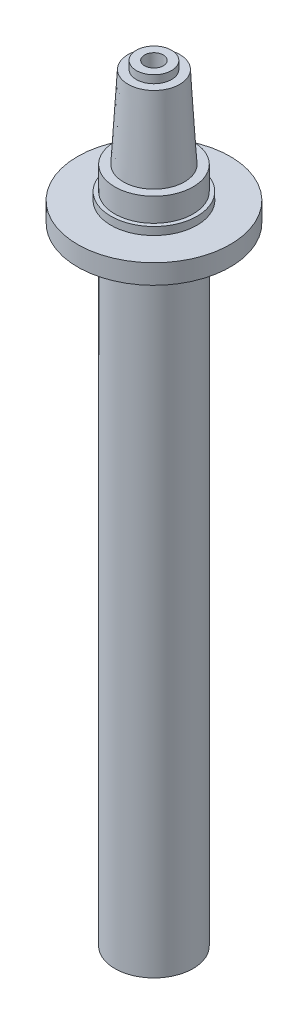
ISO-10303-21;
HEADER;
FILE_DESCRIPTION(('STEP AP214'),'2;1');
FILE_NAME('part.step','',(''),(''),'','','');
FILE_SCHEMA(('AUTOMOTIVE_DESIGN { 1 0 10303 214 1 1 1 1 }'));
ENDSEC;
DATA;
#1=APPLICATION_CONTEXT('core data for automotive mechanical design processes');
#2=APPLICATION_PROTOCOL_DEFINITION('international standard','automotive_design',2000,#1);
#3=PRODUCT_CONTEXT('',#1,'mechanical');
#4=PRODUCT('Part','Part','',(#3));
#5=PRODUCT_RELATED_PRODUCT_CATEGORY('part','',(#4));
#6=PRODUCT_DEFINITION_FORMATION('','',#4);
#7=PRODUCT_DEFINITION_CONTEXT('part definition',#1,'design');
#8=PRODUCT_DEFINITION('design','',#6,#7);
#9=PRODUCT_DEFINITION_SHAPE('','',#8);
#10=(LENGTH_UNIT() NAMED_UNIT(*) SI_UNIT(.MILLI.,.METRE.));
#11=(NAMED_UNIT(*) PLANE_ANGLE_UNIT() SI_UNIT($,.RADIAN.));
#12=(NAMED_UNIT(*) SI_UNIT($,.STERADIAN.) SOLID_ANGLE_UNIT());
#13=UNCERTAINTY_MEASURE_WITH_UNIT(LENGTH_MEASURE(1.E-05),#10,'distance_accuracy_value','');
#14=(GEOMETRIC_REPRESENTATION_CONTEXT(3) GLOBAL_UNCERTAINTY_ASSIGNED_CONTEXT((#13)) GLOBAL_UNIT_ASSIGNED_CONTEXT((#10,
#11,#12)) REPRESENTATION_CONTEXT('',''));
#15=CARTESIAN_POINT('',(0.,0.,0.));
#16=DIRECTION('',(0.,0.,1.));
#17=DIRECTION('',(1.,0.,0.));
#18=AXIS2_PLACEMENT_3D('',#15,#16,#17);
#19=CARTESIAN_POINT('',(0.,92.,0.));
#20=DIRECTION('',(0.,1.,0.));
#21=DIRECTION('',(-1.,0.,0.));
#22=AXIS2_PLACEMENT_3D('',#19,#20,#21);
#23=CYLINDRICAL_SURFACE('',#22,5.);
#24=CARTESIAN_POINT('',(0.,83.5,0.));
#25=DIRECTION('',(0.,1.,0.));
#26=DIRECTION('',(-1.,0.,0.));
#27=AXIS2_PLACEMENT_3D('',#24,#25,#26);
#28=CIRCLE('',#27,5.);
#29=CARTESIAN_POINT('',(-5.,83.5,0.));
#30=VERTEX_POINT('',#29);
#31=EDGE_CURVE('E59',#30,#30,#28,.T.);
#32=ORIENTED_EDGE('',*,*,#31,.T.);
#33=EDGE_LOOP('',(#32));
#34=FACE_BOUND('',#33,.T.);
#35=CARTESIAN_POINT('',(0.,86.5,0.));
#36=DIRECTION('',(0.,1.,0.));
#37=DIRECTION('',(-1.,0.,0.));
#38=AXIS2_PLACEMENT_3D('',#35,#36,#37);
#39=CIRCLE('',#38,5.);
#40=CARTESIAN_POINT('',(-5.,86.5,0.));
#41=VERTEX_POINT('',#40);
#42=EDGE_CURVE('E95',#41,#41,#39,.T.);
#43=ORIENTED_EDGE('',*,*,#42,.F.);
#44=EDGE_LOOP('',(#43));
#45=FACE_BOUND('',#44,.T.);
#46=ADVANCED_FACE('F37',(#34,#45),#23,.T.);
#47=CARTESIAN_POINT('',(5.,86.5,0.));
#48=DIRECTION('',(0.,-1.,0.));
#49=DIRECTION('',(1.,0.,0.));
#50=AXIS2_PLACEMENT_3D('',#47,#48,#49);
#51=PLANE('',#50);
#52=CARTESIAN_POINT('',(0.,86.5,0.));
#53=DIRECTION('',(0.,1.,0.));
#54=DIRECTION('',(-1.,0.,0.));
#55=AXIS2_PLACEMENT_3D('',#52,#53,#54);
#56=CIRCLE('',#55,3.9);
#57=CARTESIAN_POINT('',(-3.9,86.5,0.));
#58=VERTEX_POINT('',#57);
#59=EDGE_CURVE('E91',#58,#58,#56,.T.);
#60=ORIENTED_EDGE('',*,*,#59,.F.);
#61=EDGE_LOOP('',(#60));
#62=FACE_BOUND('',#61,.T.);
#63=ORIENTED_EDGE('',*,*,#42,.T.);
#64=EDGE_LOOP('',(#63));
#65=FACE_BOUND('',#64,.T.);
#66=ADVANCED_FACE('F122',(#62,#65),#51,.F.);
#67=CARTESIAN_POINT('',(0.,86.5,0.));
#68=DIRECTION('',(0.,-1.,0.));
#69=DIRECTION('',(1.,0.,0.));
#70=AXIS2_PLACEMENT_3D('',#67,#68,#69);
#71=CONICAL_SURFACE('',#70,3.9,0.0570807824062647);
#72=CARTESIAN_POINT('',(0.,97.,0.));
#73=DIRECTION('',(0.,1.,0.));
#74=DIRECTION('',(-1.,0.,0.));
#75=AXIS2_PLACEMENT_3D('',#72,#73,#74);
#76=CIRCLE('',#75,3.3);
#77=CARTESIAN_POINT('',(-3.3,97.,0.));
#78=VERTEX_POINT('',#77);
#79=EDGE_CURVE('E87',#78,#78,#76,.T.);
#80=ORIENTED_EDGE('',*,*,#79,.F.);
#81=EDGE_LOOP('',(#80));
#82=FACE_BOUND('',#81,.T.);
#83=ORIENTED_EDGE('',*,*,#59,.T.);
#84=EDGE_LOOP('',(#83));
#85=FACE_BOUND('',#84,.T.);
#86=ADVANCED_FACE('F129',(#82,#85),#71,.T.);
#87=CARTESIAN_POINT('',(3.3,97.,0.));
#88=DIRECTION('',(0.,-1.,0.));
#89=DIRECTION('',(1.,0.,0.));
#90=AXIS2_PLACEMENT_3D('',#87,#88,#89);
#91=PLANE('',#90);
#92=CARTESIAN_POINT('',(0.,97.,0.));
#93=DIRECTION('',(0.,1.,0.));
#94=DIRECTION('',(-1.,0.,0.));
#95=AXIS2_PLACEMENT_3D('',#92,#93,#94);
#96=CIRCLE('',#95,2.25);
#97=CARTESIAN_POINT('',(-2.25,97.,0.));
#98=VERTEX_POINT('',#97);
#99=EDGE_CURVE('E83',#98,#98,#96,.T.);
#100=ORIENTED_EDGE('',*,*,#99,.F.);
#101=EDGE_LOOP('',(#100));
#102=FACE_BOUND('',#101,.T.);
#103=ORIENTED_EDGE('',*,*,#79,.T.);
#104=EDGE_LOOP('',(#103));
#105=FACE_BOUND('',#104,.T.);
#106=ADVANCED_FACE('F168',(#102,#105),#91,.F.);
#107=CARTESIAN_POINT('',(0.,92.,0.));
#108=DIRECTION('',(0.,1.,0.));
#109=DIRECTION('',(-1.,0.,0.));
#110=AXIS2_PLACEMENT_3D('',#107,#108,#109);
#111=CYLINDRICAL_SURFACE('',#110,2.25);
#112=CARTESIAN_POINT('',(0.,98.,0.));
#113=DIRECTION('',(0.,1.,0.));
#114=DIRECTION('',(-1.,0.,0.));
#115=AXIS2_PLACEMENT_3D('',#112,#113,#114);
#116=CIRCLE('',#115,2.25);
#117=CARTESIAN_POINT('',(-2.25,98.,0.));
#118=VERTEX_POINT('',#117);
#119=EDGE_CURVE('E79',#118,#118,#116,.T.);
#120=ORIENTED_EDGE('',*,*,#119,.F.);
#121=EDGE_LOOP('',(#120));
#122=FACE_BOUND('',#121,.T.);
#123=ORIENTED_EDGE('',*,*,#99,.T.);
#124=EDGE_LOOP('',(#123));
#125=FACE_BOUND('',#124,.T.);
#126=ADVANCED_FACE('F175',(#122,#125),#111,.T.);
#127=CARTESIAN_POINT('',(2.25,98.,0.));
#128=DIRECTION('',(0.,-1.,0.));
#129=DIRECTION('',(1.,0.,0.));
#130=AXIS2_PLACEMENT_3D('',#127,#128,#129);
#131=PLANE('',#130);
#132=CARTESIAN_POINT('',(0.,98.,0.));
#133=DIRECTION('',(0.,1.,0.));
#134=DIRECTION('',(-1.,0.,0.));
#135=AXIS2_PLACEMENT_3D('',#132,#133,#134);
#136=CIRCLE('',#135,1.2);
#137=CARTESIAN_POINT('',(-1.2,98.,0.));
#138=VERTEX_POINT('',#137);
#139=EDGE_CURVE('E69',#138,#138,#136,.T.);
#140=ORIENTED_EDGE('',*,*,#139,.F.);
#141=EDGE_LOOP('',(#140));
#142=FACE_BOUND('',#141,.T.);
#143=ORIENTED_EDGE('',*,*,#119,.T.);
#144=EDGE_LOOP('',(#143));
#145=FACE_BOUND('',#144,.T.);
#146=ADVANCED_FACE('F183',(#142,#145),#131,.F.);
#147=CARTESIAN_POINT('',(0.,92.,0.));
#148=DIRECTION('',(0.,1.,0.));
#149=DIRECTION('',(-1.,0.,0.));
#150=AXIS2_PLACEMENT_3D('',#147,#148,#149);
#151=CYLINDRICAL_SURFACE('',#150,1.2);
#152=CARTESIAN_POINT('',(0.,92.,0.));
#153=DIRECTION('',(0.,1.,0.));
#154=DIRECTION('',(-1.,0.,0.));
#155=AXIS2_PLACEMENT_3D('',#152,#153,#154);
#156=CIRCLE('',#155,1.2);
#157=CARTESIAN_POINT('',(-1.2,92.,0.));
#158=VERTEX_POINT('',#157);
#159=EDGE_CURVE('E62',#158,#158,#156,.T.);
#160=ORIENTED_EDGE('',*,*,#159,.F.);
#161=EDGE_LOOP('',(#160));
#162=FACE_BOUND('',#161,.T.);
#163=ORIENTED_EDGE('',*,*,#139,.T.);
#164=EDGE_LOOP('',(#163));
#165=FACE_BOUND('',#164,.T.);
#166=ADVANCED_FACE('F191',(#162,#165),#151,.F.);
#167=CARTESIAN_POINT('',(1.2,92.,0.));
#168=DIRECTION('',(0.,-1.,0.));
#169=DIRECTION('',(1.,0.,0.));
#170=AXIS2_PLACEMENT_3D('',#167,#168,#169);
#171=PLANE('',#170);
#172=ORIENTED_EDGE('',*,*,#159,.T.);
#173=EDGE_LOOP('',(#172));
#174=FACE_BOUND('',#173,.T.);
#175=ADVANCED_FACE('F199',(#174),#171,.F.);
#176=CARTESIAN_POINT('',(0.,83.5,0.));
#177=DIRECTION('',(0.,-1.,0.));
#178=DIRECTION('',(1.,0.,0.));
#179=AXIS2_PLACEMENT_3D('',#176,#177,#178);
#180=CYLINDRICAL_SURFACE('',#179,5.5);
#181=CARTESIAN_POINT('',(0.,83.5,0.));
#182=DIRECTION('',(0.,1.,0.));
#183=DIRECTION('',(-1.,0.,0.));
#184=AXIS2_PLACEMENT_3D('',#181,#182,#183);
#185=CIRCLE('',#184,5.5);
#186=CARTESIAN_POINT('',(-5.5,83.5,0.));
#187=VERTEX_POINT('',#186);
#188=EDGE_CURVE('E63',#187,#187,#185,.T.);
#189=ORIENTED_EDGE('',*,*,#188,.F.);
#190=EDGE_LOOP('',(#189));
#191=FACE_BOUND('',#190,.T.);
#192=CARTESIAN_POINT('',(0.,82.5,0.));
#193=DIRECTION('',(0.,-1.,0.));
#194=DIRECTION('',(1.,0.,0.));
#195=AXIS2_PLACEMENT_3D('',#192,#193,#194);
#196=CIRCLE('',#195,5.5);
#197=CARTESIAN_POINT('',(5.5,82.5,0.));
#198=VERTEX_POINT('',#197);
#199=EDGE_CURVE('E10',#198,#198,#196,.F.);
#200=ORIENTED_EDGE('',*,*,#199,.T.);
#201=EDGE_LOOP('',(#200));
#202=FACE_BOUND('',#201,.T.);
#203=ADVANCED_FACE('F206',(#191,#202),#180,.T.);
#204=CARTESIAN_POINT('',(0.,83.5,0.));
#205=DIRECTION('',(0.,1.,0.));
#206=DIRECTION('',(-1.,0.,0.));
#207=AXIS2_PLACEMENT_3D('',#204,#205,#206);
#208=PLANE('',#207);
#209=ORIENTED_EDGE('',*,*,#31,.F.);
#210=EDGE_LOOP('',(#209));
#211=FACE_BOUND('',#210,.T.);
#212=ORIENTED_EDGE('',*,*,#188,.T.);
#213=EDGE_LOOP('',(#212));
#214=FACE_BOUND('',#213,.T.);
#215=ADVANCED_FACE('F119',(#211,#214),#208,.T.);
#216=CARTESIAN_POINT('',(0.,0.,0.));
#217=DIRECTION('',(0.,1.,0.));
#218=DIRECTION('',(-1.,0.,0.));
#219=AXIS2_PLACEMENT_3D('',#216,#217,#218);
#220=PLANE('',#219);
#221=CARTESIAN_POINT('',(0.,0.,0.));
#222=DIRECTION('',(0.,1.,0.));
#223=DIRECTION('',(-1.,0.,0.));
#224=AXIS2_PLACEMENT_3D('',#221,#222,#223);
#225=CIRCLE('',#224,5.);
#226=CARTESIAN_POINT('',(-5.,0.,0.));
#227=VERTEX_POINT('',#226);
#228=EDGE_CURVE('E45',#227,#227,#225,.T.);
#229=ORIENTED_EDGE('',*,*,#228,.F.);
#230=EDGE_LOOP('',(#229));
#231=FACE_BOUND('',#230,.T.);
#232=ADVANCED_FACE('F39',(#231),#220,.F.);
#233=CARTESIAN_POINT('',(0.,92.,0.));
#234=DIRECTION('',(0.,1.,0.));
#235=DIRECTION('',(-1.,0.,0.));
#236=AXIS2_PLACEMENT_3D('',#233,#234,#235);
#237=CYLINDRICAL_SURFACE('',#236,5.);
#238=CARTESIAN_POINT('',(0.,80.,0.));
#239=DIRECTION('',(0.,1.,0.));
#240=DIRECTION('',(-1.,0.,0.));
#241=AXIS2_PLACEMENT_3D('',#238,#239,#240);
#242=CIRCLE('',#241,5.);
#243=CARTESIAN_POINT('',(-5.,80.,0.));
#244=VERTEX_POINT('',#243);
#245=EDGE_CURVE('E50',#244,#244,#242,.T.);
#246=ORIENTED_EDGE('',*,*,#245,.F.);
#247=EDGE_LOOP('',(#246));
#248=FACE_BOUND('',#247,.T.);
#249=ORIENTED_EDGE('',*,*,#228,.T.);
#250=EDGE_LOOP('',(#249));
#251=FACE_BOUND('',#250,.T.);
#252=ADVANCED_FACE('F111',(#248,#251),#237,.T.);
#253=CARTESIAN_POINT('',(5.,80.,0.));
#254=DIRECTION('',(0.,1.,0.));
#255=DIRECTION('',(-1.,0.,0.));
#256=AXIS2_PLACEMENT_3D('',#253,#254,#255);
#257=PLANE('',#256);
#258=CARTESIAN_POINT('',(0.,80.,0.));
#259=DIRECTION('',(0.,1.,0.));
#260=DIRECTION('',(-1.,0.,0.));
#261=AXIS2_PLACEMENT_3D('',#258,#259,#260);
#262=CIRCLE('',#261,9.75);
#263=CARTESIAN_POINT('',(-9.75,80.,0.));
#264=VERTEX_POINT('',#263);
#265=EDGE_CURVE('E56',#264,#264,#262,.T.);
#266=ORIENTED_EDGE('',*,*,#265,.F.);
#267=EDGE_LOOP('',(#266));
#268=FACE_BOUND('',#267,.T.);
#269=ORIENTED_EDGE('',*,*,#245,.T.);
#270=EDGE_LOOP('',(#269));
#271=FACE_BOUND('',#270,.T.);
#272=ADVANCED_FACE('F108',(#268,#271),#257,.F.);
#273=CARTESIAN_POINT('',(0.,92.,0.));
#274=DIRECTION('',(0.,1.,0.));
#275=DIRECTION('',(-1.,0.,0.));
#276=AXIS2_PLACEMENT_3D('',#273,#274,#275);
#277=CYLINDRICAL_SURFACE('',#276,9.75);
#278=CARTESIAN_POINT('',(0.,82.5,0.));
#279=DIRECTION('',(0.,1.,0.));
#280=DIRECTION('',(-1.,0.,0.));
#281=AXIS2_PLACEMENT_3D('',#278,#279,#280);
#282=CIRCLE('',#281,9.75);
#283=CARTESIAN_POINT('',(-9.75,82.5,0.));
#284=VERTEX_POINT('',#283);
#285=EDGE_CURVE('E99',#284,#284,#282,.T.);
#286=ORIENTED_EDGE('',*,*,#285,.F.);
#287=EDGE_LOOP('',(#286));
#288=FACE_BOUND('',#287,.T.);
#289=ORIENTED_EDGE('',*,*,#265,.T.);
#290=EDGE_LOOP('',(#289));
#291=FACE_BOUND('',#290,.T.);
#292=ADVANCED_FACE('F106',(#288,#291),#277,.T.);
#293=CARTESIAN_POINT('',(9.75,82.5,0.));
#294=DIRECTION('',(0.,-1.,0.));
#295=DIRECTION('',(1.,0.,0.));
#296=AXIS2_PLACEMENT_3D('',#293,#294,#295);
#297=PLANE('',#296);
#298=ORIENTED_EDGE('',*,*,#199,.F.);
#299=EDGE_LOOP('',(#298));
#300=FACE_BOUND('',#299,.T.);
#301=ORIENTED_EDGE('',*,*,#285,.T.);
#302=EDGE_LOOP('',(#301));
#303=FACE_BOUND('',#302,.T.);
#304=ADVANCED_FACE('F135',(#300,#303),#297,.F.);
#305=CLOSED_SHELL('',(#46,#66,#86,#106,#126,#146,#166,#175,#203,#215,#232,#252,#272,#292,#304));
#306=MANIFOLD_SOLID_BREP('B2',#305);
#307=ADVANCED_BREP_SHAPE_REPRESENTATION('',(#18,#306),#14);
#308=SHAPE_DEFINITION_REPRESENTATION(#9,#307);
ENDSEC;
END-ISO-10303-21;
